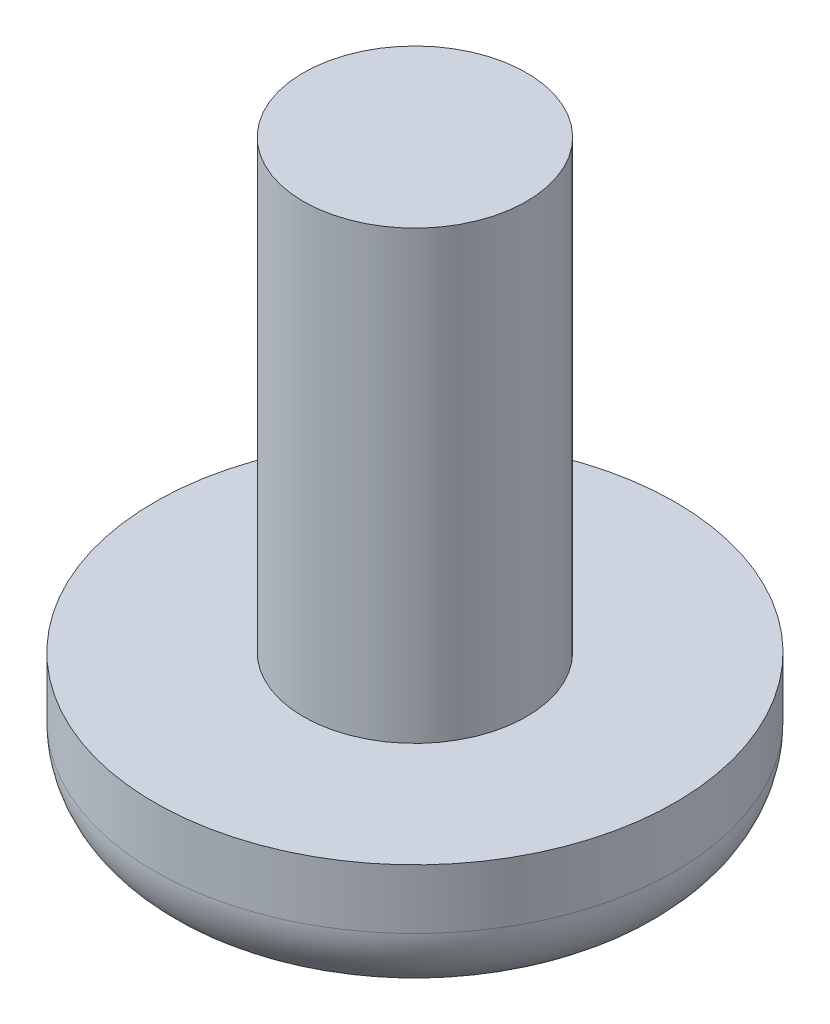
ISO-10303-21;
HEADER;
FILE_DESCRIPTION(('STEP AP214'),'2;1');
FILE_NAME('part.step','',(''),(''),'','','');
FILE_SCHEMA(('AUTOMOTIVE_DESIGN { 1 0 10303 214 1 1 1 1 }'));
ENDSEC;
DATA;
#1=APPLICATION_CONTEXT('core data for automotive mechanical design processes');
#2=APPLICATION_PROTOCOL_DEFINITION('international standard','automotive_design',2000,#1);
#3=PRODUCT_CONTEXT('',#1,'mechanical');
#4=PRODUCT('Part','Part','',(#3));
#5=PRODUCT_RELATED_PRODUCT_CATEGORY('part','',(#4));
#6=PRODUCT_DEFINITION_FORMATION('','',#4);
#7=PRODUCT_DEFINITION_CONTEXT('part definition',#1,'design');
#8=PRODUCT_DEFINITION('design','',#6,#7);
#9=PRODUCT_DEFINITION_SHAPE('','',#8);
#10=(LENGTH_UNIT() NAMED_UNIT(*) SI_UNIT(.MILLI.,.METRE.));
#11=(NAMED_UNIT(*) PLANE_ANGLE_UNIT() SI_UNIT($,.RADIAN.));
#12=(NAMED_UNIT(*) SI_UNIT($,.STERADIAN.) SOLID_ANGLE_UNIT());
#13=UNCERTAINTY_MEASURE_WITH_UNIT(LENGTH_MEASURE(1.E-05),#10,'distance_accuracy_value','');
#14=(GEOMETRIC_REPRESENTATION_CONTEXT(3) GLOBAL_UNCERTAINTY_ASSIGNED_CONTEXT((#13)) GLOBAL_UNIT_ASSIGNED_CONTEXT((#10,
#11,#12)) REPRESENTATION_CONTEXT('',''));
#15=CARTESIAN_POINT('',(0.,0.,0.));
#16=DIRECTION('',(0.,0.,1.));
#17=DIRECTION('',(1.,0.,0.));
#18=AXIS2_PLACEMENT_3D('',#15,#16,#17);
#19=CARTESIAN_POINT('',(0.,6.,0.));
#20=DIRECTION('',(0.,-1.,0.));
#21=DIRECTION('',(0.,0.,-1.));
#22=AXIS2_PLACEMENT_3D('',#19,#20,#21);
#23=CYLINDRICAL_SURFACE('',#22,1.5);
#24=CARTESIAN_POINT('',(0.,6.,0.));
#25=DIRECTION('',(0.,1.,0.));
#26=DIRECTION('',(0.,0.,1.));
#27=AXIS2_PLACEMENT_3D('',#24,#25,#26);
#28=CIRCLE('',#27,1.5);
#29=CARTESIAN_POINT('',(0.,6.,1.5));
#30=VERTEX_POINT('',#29);
#31=EDGE_CURVE('E172',#30,#30,#28,.T.);
#32=ORIENTED_EDGE('',*,*,#31,.F.);
#33=EDGE_LOOP('',(#32));
#34=FACE_BOUND('',#33,.T.);
#35=CARTESIAN_POINT('',(0.,0.,0.));
#36=DIRECTION('',(0.,1.,0.));
#37=DIRECTION('',(0.,0.,1.));
#38=AXIS2_PLACEMENT_3D('',#35,#36,#37);
#39=CIRCLE('',#38,1.5);
#40=CARTESIAN_POINT('',(0.,0.,1.5));
#41=VERTEX_POINT('',#40);
#42=EDGE_CURVE('E171',#41,#41,#39,.T.);
#43=ORIENTED_EDGE('',*,*,#42,.T.);
#44=EDGE_LOOP('',(#43));
#45=FACE_BOUND('',#44,.T.);
#46=ADVANCED_FACE('F43',(#34,#45),#23,.T.);
#47=CARTESIAN_POINT('',(0.,6.,0.));
#48=DIRECTION('',(0.,1.,0.));
#49=DIRECTION('',(0.,0.,1.));
#50=AXIS2_PLACEMENT_3D('',#47,#48,#49);
#51=PLANE('',#50);
#52=ORIENTED_EDGE('',*,*,#31,.T.);
#53=EDGE_LOOP('',(#52));
#54=FACE_BOUND('',#53,.T.);
#55=ADVANCED_FACE('F194',(#54),#51,.T.);
#56=CARTESIAN_POINT('',(0.,-1.8,0.));
#57=DIRECTION('',(0.,1.,0.));
#58=DIRECTION('',(0.,0.,1.));
#59=AXIS2_PLACEMENT_3D('',#56,#57,#58);
#60=CYLINDRICAL_SURFACE('',#59,3.5);
#61=CARTESIAN_POINT('',(0.,-0.8,0.));
#62=DIRECTION('',(0.,-1.,0.));
#63=DIRECTION('',(0.,0.,-1.));
#64=AXIS2_PLACEMENT_3D('',#61,#62,#63);
#65=CIRCLE('',#64,3.5);
#66=CARTESIAN_POINT('',(0.,-0.8,-3.5));
#67=VERTEX_POINT('',#66);
#68=EDGE_CURVE('E11',#67,#67,#65,.F.);
#69=ORIENTED_EDGE('',*,*,#68,.T.);
#70=EDGE_LOOP('',(#69));
#71=FACE_BOUND('',#70,.T.);
#72=CARTESIAN_POINT('',(0.,0.,0.));
#73=DIRECTION('',(0.,-1.,0.));
#74=DIRECTION('',(0.,0.,-1.));
#75=AXIS2_PLACEMENT_3D('',#72,#73,#74);
#76=CIRCLE('',#75,3.5);
#77=CARTESIAN_POINT('',(0.,0.,-3.5));
#78=VERTEX_POINT('',#77);
#79=EDGE_CURVE('E158',#78,#78,#76,.T.);
#80=ORIENTED_EDGE('',*,*,#79,.T.);
#81=EDGE_LOOP('',(#80));
#82=FACE_BOUND('',#81,.T.);
#83=ADVANCED_FACE('F199',(#71,#82),#60,.T.);
#84=CARTESIAN_POINT('',(0.,-1.8,0.));
#85=DIRECTION('',(0.,-1.,0.));
#86=DIRECTION('',(0.,0.,-1.));
#87=AXIS2_PLACEMENT_3D('',#84,#85,#86);
#88=PLANE('',#87);
#89=CARTESIAN_POINT('',(0.,-1.8,0.));
#90=DIRECTION('',(0.,-1.,0.));
#91=DIRECTION('',(0.,0.,-1.));
#92=AXIS2_PLACEMENT_3D('',#89,#90,#91);
#93=CIRCLE('',#92,2.5);
#94=CARTESIAN_POINT('',(0.,-1.8,-2.5));
#95=VERTEX_POINT('',#94);
#96=EDGE_CURVE('E52',#95,#95,#93,.T.);
#97=ORIENTED_EDGE('',*,*,#96,.T.);
#98=EDGE_LOOP('',(#97));
#99=FACE_BOUND('',#98,.T.);
#100=DIRECTION('',(0.,0.,1.));
#101=VECTOR('',#100,1.);
#102=CARTESIAN_POINT('',(1.,-1.8,-0.577350269189626));
#103=LINE('',#102,#101);
#104=CARTESIAN_POINT('',(1.,-1.8,-0.577350269189626));
#105=VERTEX_POINT('',#104);
#106=CARTESIAN_POINT('',(1.,-1.8,0.577350269189626));
#107=VERTEX_POINT('',#106);
#108=EDGE_CURVE('E59',#105,#107,#103,.T.);
#109=ORIENTED_EDGE('',*,*,#108,.F.);
#110=DIRECTION('',(0.866025403784439,0.,0.5));
#111=VECTOR('',#110,1.);
#112=CARTESIAN_POINT('',(0.,-1.8,-1.15470053837925));
#113=LINE('',#112,#111);
#114=CARTESIAN_POINT('',(0.,-1.8,-1.15470053837925));
#115=VERTEX_POINT('',#114);
#116=EDGE_CURVE('E152',#115,#105,#113,.T.);
#117=ORIENTED_EDGE('',*,*,#116,.F.);
#118=DIRECTION('',(0.866025403784439,0.,-0.5));
#119=VECTOR('',#118,1.);
#120=CARTESIAN_POINT('',(-1.,-1.8,-0.577350269189626));
#121=LINE('',#120,#119);
#122=CARTESIAN_POINT('',(-1.,-1.8,-0.577350269189626));
#123=VERTEX_POINT('',#122);
#124=EDGE_CURVE('E149',#123,#115,#121,.T.);
#125=ORIENTED_EDGE('',*,*,#124,.F.);
#126=DIRECTION('',(0.,0.,-1.));
#127=VECTOR('',#126,1.);
#128=CARTESIAN_POINT('',(-1.,-1.8,0.577350269189626));
#129=LINE('',#128,#127);
#130=CARTESIAN_POINT('',(-1.,-1.8,0.577350269189626));
#131=VERTEX_POINT('',#130);
#132=EDGE_CURVE('E107',#131,#123,#129,.T.);
#133=ORIENTED_EDGE('',*,*,#132,.F.);
#134=DIRECTION('',(-0.866025403784439,0.,-0.5));
#135=VECTOR('',#134,1.);
#136=CARTESIAN_POINT('',(0.,-1.8,1.15470053837925));
#137=LINE('',#136,#135);
#138=CARTESIAN_POINT('',(0.,-1.8,1.15470053837925));
#139=VERTEX_POINT('',#138);
#140=EDGE_CURVE('E143',#139,#131,#137,.T.);
#141=ORIENTED_EDGE('',*,*,#140,.F.);
#142=DIRECTION('',(-0.866025403784439,0.,0.5));
#143=VECTOR('',#142,1.);
#144=CARTESIAN_POINT('',(1.,-1.8,0.577350269189626));
#145=LINE('',#144,#143);
#146=EDGE_CURVE('E139',#107,#139,#145,.T.);
#147=ORIENTED_EDGE('',*,*,#146,.F.);
#148=EDGE_LOOP('',(#109,#117,#125,#133,#141,#147));
#149=FACE_BOUND('',#148,.T.);
#150=ADVANCED_FACE('F182',(#99,#149),#88,.T.);
#151=CARTESIAN_POINT('',(0.,0.,0.));
#152=DIRECTION('',(0.,-1.,0.));
#153=DIRECTION('',(0.,0.,-1.));
#154=AXIS2_PLACEMENT_3D('',#151,#152,#153);
#155=PLANE('',#154);
#156=ORIENTED_EDGE('',*,*,#42,.F.);
#157=EDGE_LOOP('',(#156));
#158=FACE_BOUND('',#157,.T.);
#159=ORIENTED_EDGE('',*,*,#79,.F.);
#160=EDGE_LOOP('',(#159));
#161=FACE_BOUND('',#160,.T.);
#162=ADVANCED_FACE('F208',(#158,#161),#155,.F.);
#163=CARTESIAN_POINT('',(1.,-0.8,-0.577350269189626));
#164=DIRECTION('',(1.,0.,0.));
#165=DIRECTION('',(0.,0.,-1.));
#166=AXIS2_PLACEMENT_3D('',#163,#164,#165);
#167=PLANE('',#166);
#168=ORIENTED_EDGE('',*,*,#108,.T.);
#169=DIRECTION('',(0.,-1.,0.));
#170=VECTOR('',#169,1.);
#171=CARTESIAN_POINT('',(1.,-0.8,0.577350269189626));
#172=LINE('',#171,#170);
#173=CARTESIAN_POINT('',(1.,-0.8,0.577350269189626));
#174=VERTEX_POINT('',#173);
#175=EDGE_CURVE('E89',#174,#107,#172,.T.);
#176=ORIENTED_EDGE('',*,*,#175,.F.);
#177=DIRECTION('',(0.,0.,1.));
#178=VECTOR('',#177,1.);
#179=CARTESIAN_POINT('',(1.,-0.8,-0.577350269189626));
#180=LINE('',#179,#178);
#181=CARTESIAN_POINT('',(1.,-0.8,-0.577350269189626));
#182=VERTEX_POINT('',#181);
#183=EDGE_CURVE('E155',#182,#174,#180,.T.);
#184=ORIENTED_EDGE('',*,*,#183,.F.);
#185=DIRECTION('',(0.,-1.,0.));
#186=VECTOR('',#185,1.);
#187=CARTESIAN_POINT('',(1.,-0.8,-0.577350269189626));
#188=LINE('',#187,#186);
#189=EDGE_CURVE('E67',#182,#105,#188,.T.);
#190=ORIENTED_EDGE('',*,*,#189,.T.);
#191=EDGE_LOOP('',(#168,#176,#184,#190));
#192=FACE_BOUND('',#191,.T.);
#193=ADVANCED_FACE('F211',(#192),#167,.F.);
#194=CARTESIAN_POINT('',(0.,-0.8,-1.15470053837925));
#195=DIRECTION('',(0.5,0.,-0.866025403784439));
#196=DIRECTION('',(-0.866025403784439,0.,-0.5));
#197=AXIS2_PLACEMENT_3D('',#194,#195,#196);
#198=PLANE('',#197);
#199=ORIENTED_EDGE('',*,*,#116,.T.);
#200=ORIENTED_EDGE('',*,*,#189,.F.);
#201=DIRECTION('',(0.866025403784439,0.,0.5));
#202=VECTOR('',#201,1.);
#203=CARTESIAN_POINT('',(0.,-0.8,-1.15470053837925));
#204=LINE('',#203,#202);
#205=CARTESIAN_POINT('',(0.,-0.8,-1.15470053837925));
#206=VERTEX_POINT('',#205);
#207=EDGE_CURVE('E121',#206,#182,#204,.T.);
#208=ORIENTED_EDGE('',*,*,#207,.F.);
#209=DIRECTION('',(0.,-1.,0.));
#210=VECTOR('',#209,1.);
#211=CARTESIAN_POINT('',(0.,-0.8,-1.15470053837925));
#212=LINE('',#211,#210);
#213=EDGE_CURVE('E112',#206,#115,#212,.T.);
#214=ORIENTED_EDGE('',*,*,#213,.T.);
#215=EDGE_LOOP('',(#199,#200,#208,#214));
#216=FACE_BOUND('',#215,.T.);
#217=ADVANCED_FACE('F217',(#216),#198,.F.);
#218=CARTESIAN_POINT('',(-1.,-0.8,-0.577350269189626));
#219=DIRECTION('',(-0.5,0.,-0.866025403784439));
#220=DIRECTION('',(-0.866025403784439,0.,0.5));
#221=AXIS2_PLACEMENT_3D('',#218,#219,#220);
#222=PLANE('',#221);
#223=ORIENTED_EDGE('',*,*,#124,.T.);
#224=ORIENTED_EDGE('',*,*,#213,.F.);
#225=DIRECTION('',(0.866025403784439,0.,-0.5));
#226=VECTOR('',#225,1.);
#227=CARTESIAN_POINT('',(-1.,-0.8,-0.577350269189626));
#228=LINE('',#227,#226);
#229=CARTESIAN_POINT('',(-1.,-0.8,-0.577350269189626));
#230=VERTEX_POINT('',#229);
#231=EDGE_CURVE('E116',#230,#206,#228,.T.);
#232=ORIENTED_EDGE('',*,*,#231,.F.);
#233=DIRECTION('',(0.,-1.,0.));
#234=VECTOR('',#233,1.);
#235=CARTESIAN_POINT('',(-1.,-0.8,-0.577350269189626));
#236=LINE('',#235,#234);
#237=EDGE_CURVE('E100',#230,#123,#236,.T.);
#238=ORIENTED_EDGE('',*,*,#237,.T.);
#239=EDGE_LOOP('',(#223,#224,#232,#238));
#240=FACE_BOUND('',#239,.T.);
#241=ADVANCED_FACE('F117',(#240),#222,.F.);
#242=CARTESIAN_POINT('',(-1.,-0.8,0.577350269189626));
#243=DIRECTION('',(-1.,0.,0.));
#244=DIRECTION('',(0.,0.,1.));
#245=AXIS2_PLACEMENT_3D('',#242,#243,#244);
#246=PLANE('',#245);
#247=ORIENTED_EDGE('',*,*,#132,.T.);
#248=ORIENTED_EDGE('',*,*,#237,.F.);
#249=DIRECTION('',(0.,0.,-1.));
#250=VECTOR('',#249,1.);
#251=CARTESIAN_POINT('',(-1.,-0.8,0.577350269189626));
#252=LINE('',#251,#250);
#253=CARTESIAN_POINT('',(-1.,-0.8,0.577350269189626));
#254=VERTEX_POINT('',#253);
#255=EDGE_CURVE('E104',#254,#230,#252,.T.);
#256=ORIENTED_EDGE('',*,*,#255,.F.);
#257=DIRECTION('',(0.,-1.,0.));
#258=VECTOR('',#257,1.);
#259=CARTESIAN_POINT('',(-1.,-0.8,0.577350269189626));
#260=LINE('',#259,#258);
#261=EDGE_CURVE('E113',#254,#131,#260,.T.);
#262=ORIENTED_EDGE('',*,*,#261,.T.);
#263=EDGE_LOOP('',(#247,#248,#256,#262));
#264=FACE_BOUND('',#263,.T.);
#265=ADVANCED_FACE('F102',(#264),#246,.F.);
#266=CARTESIAN_POINT('',(0.,-0.8,1.15470053837925));
#267=DIRECTION('',(-0.5,0.,0.866025403784439));
#268=DIRECTION('',(0.866025403784439,0.,0.5));
#269=AXIS2_PLACEMENT_3D('',#266,#267,#268);
#270=PLANE('',#269);
#271=ORIENTED_EDGE('',*,*,#140,.T.);
#272=ORIENTED_EDGE('',*,*,#261,.F.);
#273=DIRECTION('',(-0.866025403784439,0.,-0.5));
#274=VECTOR('',#273,1.);
#275=CARTESIAN_POINT('',(0.,-0.8,1.15470053837925));
#276=LINE('',#275,#274);
#277=CARTESIAN_POINT('',(0.,-0.8,1.15470053837925));
#278=VERTEX_POINT('',#277);
#279=EDGE_CURVE('E127',#278,#254,#276,.T.);
#280=ORIENTED_EDGE('',*,*,#279,.F.);
#281=DIRECTION('',(0.,-1.,0.));
#282=VECTOR('',#281,1.);
#283=CARTESIAN_POINT('',(0.,-0.8,1.15470053837925));
#284=LINE('',#283,#282);
#285=EDGE_CURVE('E163',#278,#139,#284,.T.);
#286=ORIENTED_EDGE('',*,*,#285,.T.);
#287=EDGE_LOOP('',(#271,#272,#280,#286));
#288=FACE_BOUND('',#287,.T.);
#289=ADVANCED_FACE('F220',(#288),#270,.F.);
#290=CARTESIAN_POINT('',(1.,-0.8,0.577350269189626));
#291=DIRECTION('',(0.5,0.,0.866025403784439));
#292=DIRECTION('',(0.866025403784439,0.,-0.5));
#293=AXIS2_PLACEMENT_3D('',#290,#291,#292);
#294=PLANE('',#293);
#295=ORIENTED_EDGE('',*,*,#146,.T.);
#296=ORIENTED_EDGE('',*,*,#285,.F.);
#297=DIRECTION('',(-0.866025403784439,0.,0.5));
#298=VECTOR('',#297,1.);
#299=CARTESIAN_POINT('',(1.,-0.8,0.577350269189626));
#300=LINE('',#299,#298);
#301=EDGE_CURVE('E131',#174,#278,#300,.T.);
#302=ORIENTED_EDGE('',*,*,#301,.F.);
#303=ORIENTED_EDGE('',*,*,#175,.T.);
#304=EDGE_LOOP('',(#295,#296,#302,#303));
#305=FACE_BOUND('',#304,.T.);
#306=ADVANCED_FACE('F190',(#305),#294,.F.);
#307=CARTESIAN_POINT('',(0.,-0.8,0.));
#308=DIRECTION('',(0.,-1.,0.));
#309=DIRECTION('',(0.,0.,-1.));
#310=AXIS2_PLACEMENT_3D('',#307,#308,#309);
#311=PLANE('',#310);
#312=ORIENTED_EDGE('',*,*,#183,.T.);
#313=ORIENTED_EDGE('',*,*,#301,.T.);
#314=ORIENTED_EDGE('',*,*,#279,.T.);
#315=ORIENTED_EDGE('',*,*,#255,.T.);
#316=ORIENTED_EDGE('',*,*,#231,.T.);
#317=ORIENTED_EDGE('',*,*,#207,.T.);
#318=EDGE_LOOP('',(#312,#313,#314,#315,#316,#317));
#319=FACE_BOUND('',#318,.T.);
#320=ADVANCED_FACE('F124',(#319),#311,.T.);
#321=CARTESIAN_POINT('',(0.,-0.8,0.));
#322=DIRECTION('',(0.,-1.,0.));
#323=DIRECTION('',(0.,0.,-1.));
#324=AXIS2_PLACEMENT_3D('',#321,#322,#323);
#325=TOROIDAL_SURFACE('',#324,2.5,1.);
#326=ORIENTED_EDGE('',*,*,#68,.F.);
#327=EDGE_LOOP('',(#326));
#328=FACE_BOUND('',#327,.T.);
#329=ORIENTED_EDGE('',*,*,#96,.F.);
#330=EDGE_LOOP('',(#329));
#331=FACE_BOUND('',#330,.T.);
#332=ADVANCED_FACE('F45',(#328,#331),#325,.T.);
#333=CLOSED_SHELL('',(#46,#55,#83,#150,#162,#193,#217,#241,#265,#289,#306,#320,#332));
#334=MANIFOLD_SOLID_BREP('B2',#333);
#335=ADVANCED_BREP_SHAPE_REPRESENTATION('',(#18,#334),#14);
#336=SHAPE_DEFINITION_REPRESENTATION(#9,#335);
ENDSEC;
END-ISO-10303-21;
